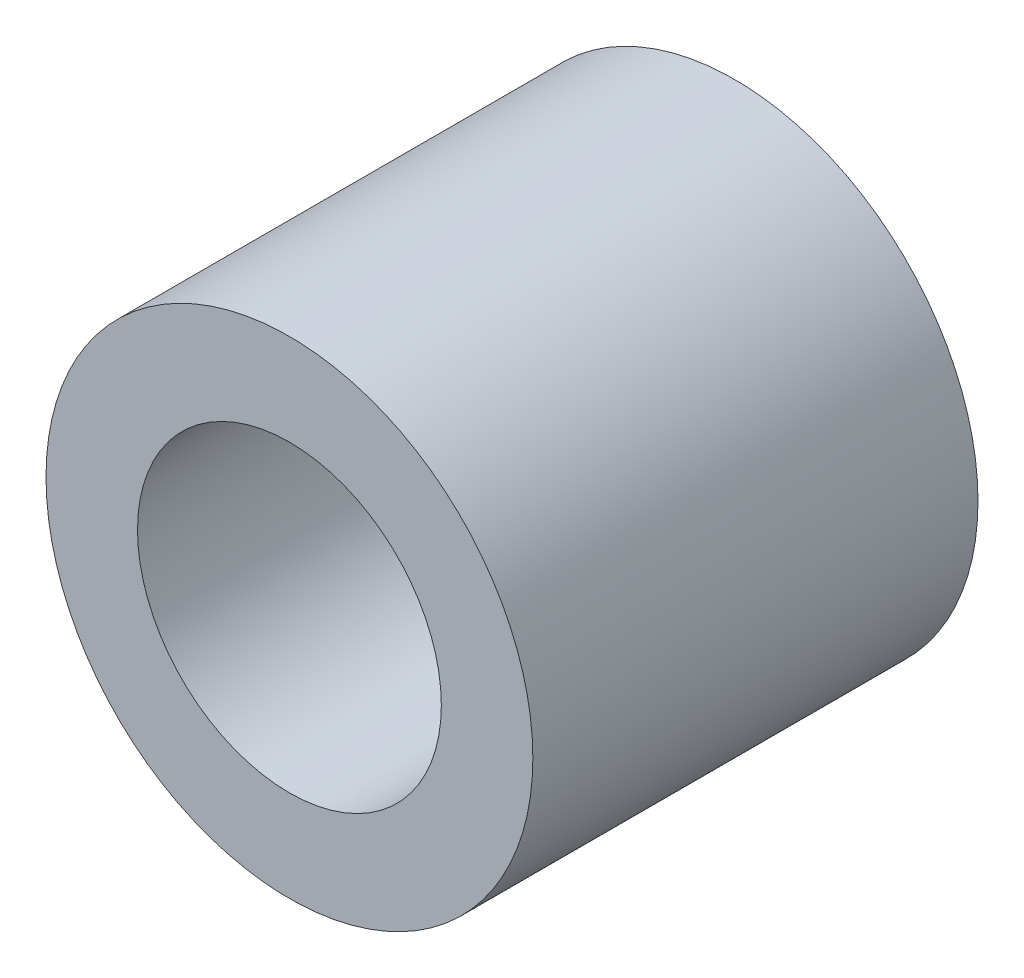
ISO-10303-21;
HEADER;
FILE_DESCRIPTION(('STEP AP214'),'2;1');
FILE_NAME('part.step','',(''),(''),'','','');
FILE_SCHEMA(('AUTOMOTIVE_DESIGN { 1 0 10303 214 1 1 1 1 }'));
ENDSEC;
DATA;
#1=APPLICATION_CONTEXT('core data for automotive mechanical design processes');
#2=APPLICATION_PROTOCOL_DEFINITION('international standard','automotive_design',2000,#1);
#3=PRODUCT_CONTEXT('',#1,'mechanical');
#4=PRODUCT('Part','Part','',(#3));
#5=PRODUCT_RELATED_PRODUCT_CATEGORY('part','',(#4));
#6=PRODUCT_DEFINITION_FORMATION('','',#4);
#7=PRODUCT_DEFINITION_CONTEXT('part definition',#1,'design');
#8=PRODUCT_DEFINITION('design','',#6,#7);
#9=PRODUCT_DEFINITION_SHAPE('','',#8);
#10=(LENGTH_UNIT() NAMED_UNIT(*) SI_UNIT(.MILLI.,.METRE.));
#11=(NAMED_UNIT(*) PLANE_ANGLE_UNIT() SI_UNIT($,.RADIAN.));
#12=(NAMED_UNIT(*) SI_UNIT($,.STERADIAN.) SOLID_ANGLE_UNIT());
#13=UNCERTAINTY_MEASURE_WITH_UNIT(LENGTH_MEASURE(1.E-05),#10,'distance_accuracy_value','');
#14=(GEOMETRIC_REPRESENTATION_CONTEXT(3) GLOBAL_UNCERTAINTY_ASSIGNED_CONTEXT((#13)) GLOBAL_UNIT_ASSIGNED_CONTEXT((#10,
#11,#12)) REPRESENTATION_CONTEXT('',''));
#15=CARTESIAN_POINT('',(0.,0.,0.));
#16=DIRECTION('',(0.,0.,1.));
#17=DIRECTION('',(1.,0.,0.));
#18=AXIS2_PLACEMENT_3D('',#15,#16,#17);
#19=CARTESIAN_POINT('',(0.,0.,20.32));
#20=DIRECTION('',(0.,0.,1.));
#21=DIRECTION('',(1.,0.,0.));
#22=AXIS2_PLACEMENT_3D('',#19,#20,#21);
#23=PLANE('',#22);
#24=CARTESIAN_POINT('',(0.,0.,20.32));
#25=DIRECTION('',(0.,0.,1.));
#26=DIRECTION('',(1.,0.,0.));
#27=AXIS2_PLACEMENT_3D('',#24,#25,#26);
#28=CIRCLE('',#27,11.1125);
#29=CARTESIAN_POINT('',(11.1125,0.,20.32));
#30=VERTEX_POINT('',#29);
#31=EDGE_CURVE('E10',#30,#30,#28,.T.);
#32=ORIENTED_EDGE('',*,*,#31,.T.);
#33=EDGE_LOOP('',(#32));
#34=FACE_BOUND('',#33,.T.);
#35=CARTESIAN_POINT('',(0.,0.,20.32));
#36=DIRECTION('',(0.,0.,1.));
#37=DIRECTION('',(1.,0.,0.));
#38=AXIS2_PLACEMENT_3D('',#35,#36,#37);
#39=CIRCLE('',#38,6.9342);
#40=CARTESIAN_POINT('',(6.9342,0.,20.32));
#41=VERTEX_POINT('',#40);
#42=EDGE_CURVE('E42',#41,#41,#39,.T.);
#43=ORIENTED_EDGE('',*,*,#42,.F.);
#44=EDGE_LOOP('',(#43));
#45=FACE_BOUND('',#44,.T.);
#46=ADVANCED_FACE('F31',(#34,#45),#23,.T.);
#47=CARTESIAN_POINT('',(0.,0.,0.));
#48=DIRECTION('',(0.,0.,1.));
#49=DIRECTION('',(1.,0.,0.));
#50=AXIS2_PLACEMENT_3D('',#47,#48,#49);
#51=PLANE('',#50);
#52=CARTESIAN_POINT('',(0.,0.,0.));
#53=DIRECTION('',(0.,0.,1.));
#54=DIRECTION('',(1.,0.,0.));
#55=AXIS2_PLACEMENT_3D('',#52,#53,#54);
#56=CIRCLE('',#55,11.1125);
#57=CARTESIAN_POINT('',(11.1125,0.,0.));
#58=VERTEX_POINT('',#57);
#59=EDGE_CURVE('E35',#58,#58,#56,.T.);
#60=ORIENTED_EDGE('',*,*,#59,.F.);
#61=EDGE_LOOP('',(#60));
#62=FACE_BOUND('',#61,.T.);
#63=CARTESIAN_POINT('',(0.,0.,0.));
#64=DIRECTION('',(0.,0.,1.));
#65=DIRECTION('',(1.,0.,0.));
#66=AXIS2_PLACEMENT_3D('',#63,#64,#65);
#67=CIRCLE('',#66,6.9342);
#68=CARTESIAN_POINT('',(6.9342,0.,0.));
#69=VERTEX_POINT('',#68);
#70=EDGE_CURVE('E44',#69,#69,#67,.T.);
#71=ORIENTED_EDGE('',*,*,#70,.T.);
#72=EDGE_LOOP('',(#71));
#73=FACE_BOUND('',#72,.T.);
#74=ADVANCED_FACE('F54',(#62,#73),#51,.F.);
#75=CARTESIAN_POINT('',(0.,0.,20.32));
#76=DIRECTION('',(0.,0.,-1.));
#77=DIRECTION('',(-1.,0.,0.));
#78=AXIS2_PLACEMENT_3D('',#75,#76,#77);
#79=CYLINDRICAL_SURFACE('',#78,11.1125);
#80=ORIENTED_EDGE('',*,*,#31,.F.);
#81=EDGE_LOOP('',(#80));
#82=FACE_BOUND('',#81,.T.);
#83=ORIENTED_EDGE('',*,*,#59,.T.);
#84=EDGE_LOOP('',(#83));
#85=FACE_BOUND('',#84,.T.);
#86=ADVANCED_FACE('F33',(#82,#85),#79,.T.);
#87=CARTESIAN_POINT('',(0.,0.,20.32));
#88=DIRECTION('',(0.,0.,-1.));
#89=DIRECTION('',(-1.,0.,0.));
#90=AXIS2_PLACEMENT_3D('',#87,#88,#89);
#91=CYLINDRICAL_SURFACE('',#90,6.9342);
#92=ORIENTED_EDGE('',*,*,#42,.T.);
#93=EDGE_LOOP('',(#92));
#94=FACE_BOUND('',#93,.T.);
#95=ORIENTED_EDGE('',*,*,#70,.F.);
#96=EDGE_LOOP('',(#95));
#97=FACE_BOUND('',#96,.T.);
#98=ADVANCED_FACE('F50',(#94,#97),#91,.F.);
#99=CLOSED_SHELL('',(#46,#74,#86,#98));
#100=MANIFOLD_SOLID_BREP('B2',#99);
#101=ADVANCED_BREP_SHAPE_REPRESENTATION('',(#18,#100),#14);
#102=SHAPE_DEFINITION_REPRESENTATION(#9,#101);
ENDSEC;
END-ISO-10303-21;
